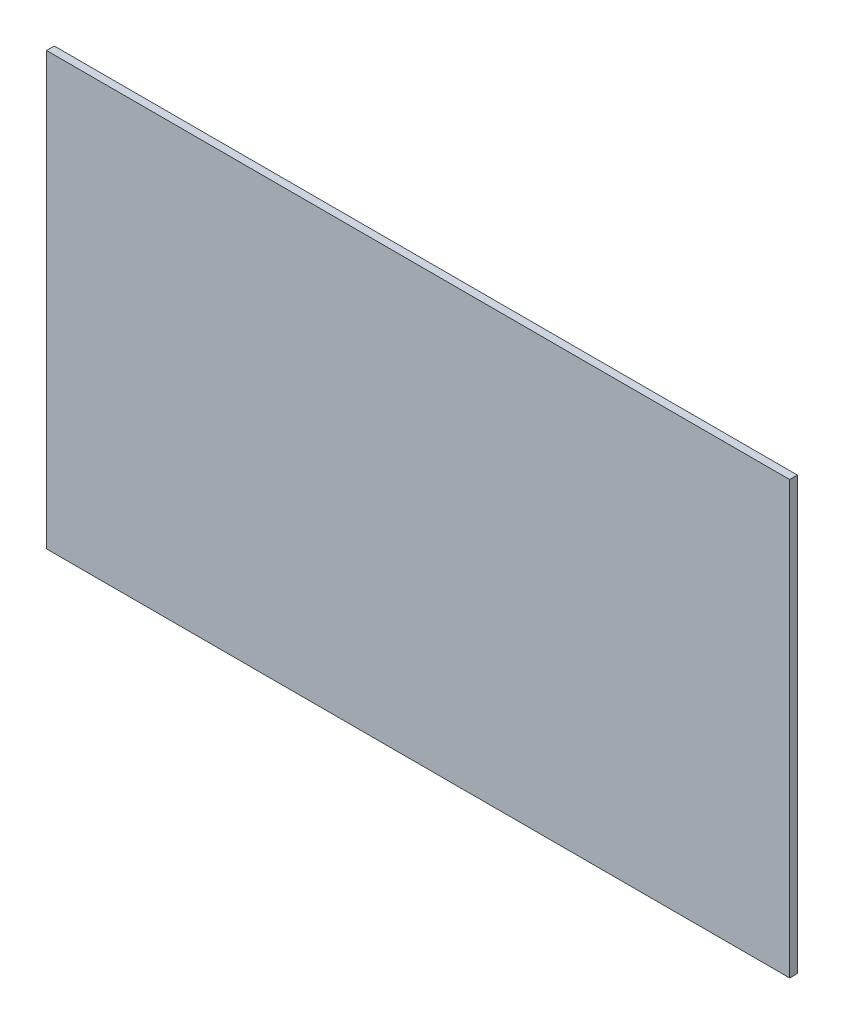
ISO-10303-21;
HEADER;
FILE_DESCRIPTION(('STEP AP214'),'2;1');
FILE_NAME('part.step','',(''),(''),'','','');
FILE_SCHEMA(('AUTOMOTIVE_DESIGN { 1 0 10303 214 1 1 1 1 }'));
ENDSEC;
DATA;
#1=APPLICATION_CONTEXT('core data for automotive mechanical design processes');
#2=APPLICATION_PROTOCOL_DEFINITION('international standard','automotive_design',2000,#1);
#3=PRODUCT_CONTEXT('',#1,'mechanical');
#4=PRODUCT('Part','Part','',(#3));
#5=PRODUCT_RELATED_PRODUCT_CATEGORY('part','',(#4));
#6=PRODUCT_DEFINITION_FORMATION('','',#4);
#7=PRODUCT_DEFINITION_CONTEXT('part definition',#1,'design');
#8=PRODUCT_DEFINITION('design','',#6,#7);
#9=PRODUCT_DEFINITION_SHAPE('','',#8);
#10=(LENGTH_UNIT() NAMED_UNIT(*) SI_UNIT(.MILLI.,.METRE.));
#11=(NAMED_UNIT(*) PLANE_ANGLE_UNIT() SI_UNIT($,.RADIAN.));
#12=(NAMED_UNIT(*) SI_UNIT($,.STERADIAN.) SOLID_ANGLE_UNIT());
#13=UNCERTAINTY_MEASURE_WITH_UNIT(LENGTH_MEASURE(1.E-05),#10,'distance_accuracy_value','');
#14=(GEOMETRIC_REPRESENTATION_CONTEXT(3) GLOBAL_UNCERTAINTY_ASSIGNED_CONTEXT((#13)) GLOBAL_UNIT_ASSIGNED_CONTEXT((#10,
#11,#12)) REPRESENTATION_CONTEXT('',''));
#15=CARTESIAN_POINT('',(0.,0.,0.));
#16=DIRECTION('',(0.,0.,1.));
#17=DIRECTION('',(1.,0.,0.));
#18=AXIS2_PLACEMENT_3D('',#15,#16,#17);
#19=CARTESIAN_POINT('',(0.,0.,3.175));
#20=DIRECTION('',(1.,0.,0.));
#21=DIRECTION('',(0.,1.,0.));
#22=AXIS2_PLACEMENT_3D('',#19,#20,#21);
#23=PLANE('',#22);
#24=DIRECTION('',(0.,-1.,0.));
#25=VECTOR('',#24,1.);
#26=CARTESIAN_POINT('',(0.,0.,0.));
#27=LINE('',#26,#25);
#28=CARTESIAN_POINT('',(0.,0.,0.));
#29=VERTEX_POINT('',#28);
#30=CARTESIAN_POINT('',(0.,-177.038,0.));
#31=VERTEX_POINT('',#30);
#32=EDGE_CURVE('E96',#29,#31,#27,.T.);
#33=ORIENTED_EDGE('',*,*,#32,.T.);
#34=DIRECTION('',(0.,0.,-1.));
#35=VECTOR('',#34,1.);
#36=CARTESIAN_POINT('',(0.,-177.038,3.175));
#37=LINE('',#36,#35);
#38=CARTESIAN_POINT('',(0.,-177.038,3.175));
#39=VERTEX_POINT('',#38);
#40=EDGE_CURVE('E11',#39,#31,#37,.T.);
#41=ORIENTED_EDGE('',*,*,#40,.F.);
#42=DIRECTION('',(0.,-1.,0.));
#43=VECTOR('',#42,1.);
#44=CARTESIAN_POINT('',(0.,0.,3.175));
#45=LINE('',#44,#43);
#46=CARTESIAN_POINT('',(0.,0.,3.175));
#47=VERTEX_POINT('',#46);
#48=EDGE_CURVE('E84',#47,#39,#45,.T.);
#49=ORIENTED_EDGE('',*,*,#48,.F.);
#50=DIRECTION('',(0.,0.,-1.));
#51=VECTOR('',#50,1.);
#52=CARTESIAN_POINT('',(0.,0.,3.175));
#53=LINE('',#52,#51);
#54=EDGE_CURVE('E92',#47,#29,#53,.T.);
#55=ORIENTED_EDGE('',*,*,#54,.T.);
#56=EDGE_LOOP('',(#33,#41,#49,#55));
#57=FACE_BOUND('',#56,.T.);
#58=ADVANCED_FACE('F33',(#57),#23,.F.);
#59=CARTESIAN_POINT('',(0.,-177.038,3.175));
#60=DIRECTION('',(0.,1.,0.));
#61=DIRECTION('',(0.,0.,1.));
#62=AXIS2_PLACEMENT_3D('',#59,#60,#61);
#63=PLANE('',#62);
#64=DIRECTION('',(1.,0.,0.));
#65=VECTOR('',#64,1.);
#66=CARTESIAN_POINT('',(0.,-177.038,0.));
#67=LINE('',#66,#65);
#68=CARTESIAN_POINT('',(304.8,-177.038,0.));
#69=VERTEX_POINT('',#68);
#70=EDGE_CURVE('E88',#31,#69,#67,.T.);
#71=ORIENTED_EDGE('',*,*,#70,.T.);
#72=DIRECTION('',(0.,0.,-1.));
#73=VECTOR('',#72,1.);
#74=CARTESIAN_POINT('',(304.8,-177.038,3.175));
#75=LINE('',#74,#73);
#76=CARTESIAN_POINT('',(304.8,-177.038,3.175));
#77=VERTEX_POINT('',#76);
#78=EDGE_CURVE('E41',#77,#69,#75,.T.);
#79=ORIENTED_EDGE('',*,*,#78,.F.);
#80=DIRECTION('',(1.,0.,0.));
#81=VECTOR('',#80,1.);
#82=CARTESIAN_POINT('',(0.,-177.038,3.175));
#83=LINE('',#82,#81);
#84=EDGE_CURVE('E79',#39,#77,#83,.T.);
#85=ORIENTED_EDGE('',*,*,#84,.F.);
#86=ORIENTED_EDGE('',*,*,#40,.T.);
#87=EDGE_LOOP('',(#71,#79,#85,#86));
#88=FACE_BOUND('',#87,.T.);
#89=ADVANCED_FACE('F87',(#88),#63,.F.);
#90=CARTESIAN_POINT('',(304.8,0.,3.175));
#91=DIRECTION('',(-1.,0.,0.));
#92=DIRECTION('',(0.,0.,1.));
#93=AXIS2_PLACEMENT_3D('',#90,#91,#92);
#94=PLANE('',#93);
#95=DIRECTION('',(0.,1.,0.));
#96=VECTOR('',#95,1.);
#97=CARTESIAN_POINT('',(304.8,0.,0.));
#98=LINE('',#97,#96);
#99=CARTESIAN_POINT('',(304.8,0.,0.));
#100=VERTEX_POINT('',#99);
#101=EDGE_CURVE('E66',#69,#100,#98,.T.);
#102=ORIENTED_EDGE('',*,*,#101,.T.);
#103=DIRECTION('',(0.,0.,-1.));
#104=VECTOR('',#103,1.);
#105=CARTESIAN_POINT('',(304.8,0.,3.175));
#106=LINE('',#105,#104);
#107=CARTESIAN_POINT('',(304.8,0.,3.175));
#108=VERTEX_POINT('',#107);
#109=EDGE_CURVE('E89',#108,#100,#106,.T.);
#110=ORIENTED_EDGE('',*,*,#109,.F.);
#111=DIRECTION('',(0.,1.,0.));
#112=VECTOR('',#111,1.);
#113=CARTESIAN_POINT('',(304.8,0.,3.175));
#114=LINE('',#113,#112);
#115=EDGE_CURVE('E82',#77,#108,#114,.T.);
#116=ORIENTED_EDGE('',*,*,#115,.F.);
#117=ORIENTED_EDGE('',*,*,#78,.T.);
#118=EDGE_LOOP('',(#102,#110,#116,#117));
#119=FACE_BOUND('',#118,.T.);
#120=ADVANCED_FACE('F90',(#119),#94,.F.);
#121=CARTESIAN_POINT('',(0.,0.,3.175));
#122=DIRECTION('',(0.,-1.,0.));
#123=DIRECTION('',(0.,0.,-1.));
#124=AXIS2_PLACEMENT_3D('',#121,#122,#123);
#125=PLANE('',#124);
#126=DIRECTION('',(-1.,0.,0.));
#127=VECTOR('',#126,1.);
#128=CARTESIAN_POINT('',(0.,0.,0.));
#129=LINE('',#128,#127);
#130=EDGE_CURVE('E72',#100,#29,#129,.T.);
#131=ORIENTED_EDGE('',*,*,#130,.T.);
#132=ORIENTED_EDGE('',*,*,#54,.F.);
#133=DIRECTION('',(-1.,0.,0.));
#134=VECTOR('',#133,1.);
#135=CARTESIAN_POINT('',(0.,0.,3.175));
#136=LINE('',#135,#134);
#137=EDGE_CURVE('E49',#108,#47,#136,.T.);
#138=ORIENTED_EDGE('',*,*,#137,.F.);
#139=ORIENTED_EDGE('',*,*,#109,.T.);
#140=EDGE_LOOP('',(#131,#132,#138,#139));
#141=FACE_BOUND('',#140,.T.);
#142=ADVANCED_FACE('F103',(#141),#125,.F.);
#143=CARTESIAN_POINT('',(0.,0.,3.175));
#144=DIRECTION('',(0.,0.,1.));
#145=DIRECTION('',(1.,0.,0.));
#146=AXIS2_PLACEMENT_3D('',#143,#144,#145);
#147=PLANE('',#146);
#148=ORIENTED_EDGE('',*,*,#48,.T.);
#149=ORIENTED_EDGE('',*,*,#84,.T.);
#150=ORIENTED_EDGE('',*,*,#115,.T.);
#151=ORIENTED_EDGE('',*,*,#137,.T.);
#152=EDGE_LOOP('',(#148,#149,#150,#151));
#153=FACE_BOUND('',#152,.T.);
#154=ADVANCED_FACE('F80',(#153),#147,.T.);
#155=CARTESIAN_POINT('',(0.,0.,0.));
#156=DIRECTION('',(0.,0.,1.));
#157=DIRECTION('',(1.,0.,0.));
#158=AXIS2_PLACEMENT_3D('',#155,#156,#157);
#159=PLANE('',#158);
#160=ORIENTED_EDGE('',*,*,#32,.F.);
#161=ORIENTED_EDGE('',*,*,#130,.F.);
#162=ORIENTED_EDGE('',*,*,#101,.F.);
#163=ORIENTED_EDGE('',*,*,#70,.F.);
#164=EDGE_LOOP('',(#160,#161,#162,#163));
#165=FACE_BOUND('',#164,.T.);
#166=ADVANCED_FACE('F106',(#165),#159,.F.);
#167=CLOSED_SHELL('',(#58,#89,#120,#142,#154,#166));
#168=MANIFOLD_SOLID_BREP('B2',#167);
#169=ADVANCED_BREP_SHAPE_REPRESENTATION('',(#18,#168),#14);
#170=SHAPE_DEFINITION_REPRESENTATION(#9,#169);
ENDSEC;
END-ISO-10303-21;
